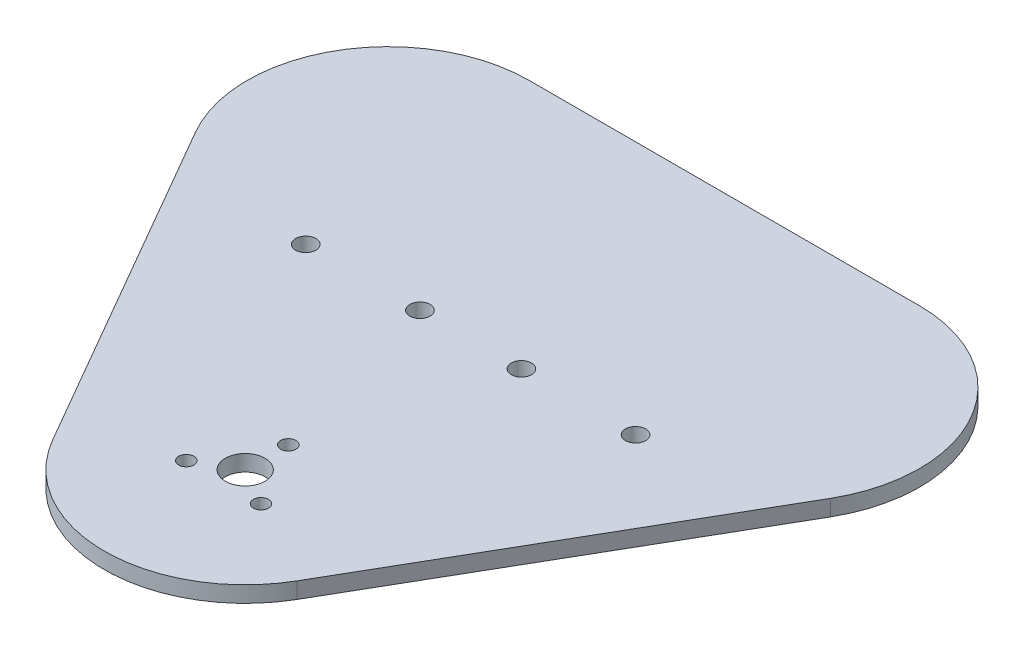
ISO-10303-21;
HEADER;
FILE_DESCRIPTION(('STEP AP214'),'2;1');
FILE_NAME('part.step','',(''),(''),'','','');
FILE_SCHEMA(('AUTOMOTIVE_DESIGN { 1 0 10303 214 1 1 1 1 }'));
ENDSEC;
DATA;
#1=APPLICATION_CONTEXT('core data for automotive mechanical design processes');
#2=APPLICATION_PROTOCOL_DEFINITION('international standard','automotive_design',2000,#1);
#3=PRODUCT_CONTEXT('',#1,'mechanical');
#4=PRODUCT('Part','Part','',(#3));
#5=PRODUCT_RELATED_PRODUCT_CATEGORY('part','',(#4));
#6=PRODUCT_DEFINITION_FORMATION('','',#4);
#7=PRODUCT_DEFINITION_CONTEXT('part definition',#1,'design');
#8=PRODUCT_DEFINITION('design','',#6,#7);
#9=PRODUCT_DEFINITION_SHAPE('','',#8);
#10=(LENGTH_UNIT() NAMED_UNIT(*) SI_UNIT(.MILLI.,.METRE.));
#11=(NAMED_UNIT(*) PLANE_ANGLE_UNIT() SI_UNIT($,.RADIAN.));
#12=(NAMED_UNIT(*) SI_UNIT($,.STERADIAN.) SOLID_ANGLE_UNIT());
#13=UNCERTAINTY_MEASURE_WITH_UNIT(LENGTH_MEASURE(1.E-05),#10,'distance_accuracy_value','');
#14=(GEOMETRIC_REPRESENTATION_CONTEXT(3) GLOBAL_UNCERTAINTY_ASSIGNED_CONTEXT((#13)) GLOBAL_UNIT_ASSIGNED_CONTEXT((#10,
#11,#12)) REPRESENTATION_CONTEXT('',''));
#15=CARTESIAN_POINT('',(0.,0.,0.));
#16=DIRECTION('',(0.,0.,1.));
#17=DIRECTION('',(1.,0.,0.));
#18=AXIS2_PLACEMENT_3D('',#15,#16,#17);
#19=CARTESIAN_POINT('',(86.6025403784437,3.175,-55.0549417933341));
#20=DIRECTION('',(-0.866025403784439,0.,-0.499999999999999));
#21=DIRECTION('',(-0.499999999999999,0.,0.866025403784439));
#22=AXIS2_PLACEMENT_3D('',#19,#20,#21);
#23=PLANE('',#22);
#24=DIRECTION('',(0.499999999999999,0.,-0.866025403784439));
#25=VECTOR('',#24,1.);
#26=CARTESIAN_POINT('',(86.6025403784437,0.,-55.0549417933341));
#27=LINE('',#26,#25);
#28=CARTESIAN_POINT('',(24.0581857171318,0.,53.2750582066658));
#29=VERTEX_POINT('',#28);
#30=CARTESIAN_POINT('',(62.5443546613121,0.,-13.3849417933341));
#31=VERTEX_POINT('',#30);
#32=EDGE_CURVE('E125',#29,#31,#27,.T.);
#33=ORIENTED_EDGE('',*,*,#32,.T.);
#34=DIRECTION('',(0.,-1.,0.));
#35=VECTOR('',#34,1.);
#36=CARTESIAN_POINT('',(62.5443546613121,3.175,-13.3849417933341));
#37=LINE('',#36,#35);
#38=CARTESIAN_POINT('',(62.5443546613121,3.175,-13.3849417933341));
#39=VERTEX_POINT('',#38);
#40=EDGE_CURVE('E101',#31,#39,#37,.F.);
#41=ORIENTED_EDGE('',*,*,#40,.T.);
#42=DIRECTION('',(0.499999999999999,0.,-0.866025403784439));
#43=VECTOR('',#42,1.);
#44=CARTESIAN_POINT('',(86.6025403784437,3.175,-55.0549417933341));
#45=LINE('',#44,#43);
#46=CARTESIAN_POINT('',(24.0581857171318,3.175,53.2750582066658));
#47=VERTEX_POINT('',#46);
#48=EDGE_CURVE('E129',#47,#39,#45,.T.);
#49=ORIENTED_EDGE('',*,*,#48,.F.);
#50=DIRECTION('',(0.,-1.,0.));
#51=VECTOR('',#50,1.);
#52=CARTESIAN_POINT('',(24.0581857171318,3.175,53.2750582066658));
#53=LINE('',#52,#51);
#54=EDGE_CURVE('E107',#47,#29,#53,.T.);
#55=ORIENTED_EDGE('',*,*,#54,.T.);
#56=EDGE_LOOP('',(#33,#41,#49,#55));
#57=FACE_BOUND('',#56,.T.);
#58=ADVANCED_FACE('F39',(#57),#23,.F.);
#59=CARTESIAN_POINT('',(-86.6025403784438,3.175,-55.0549417933341));
#60=DIRECTION('',(0.,0.,1.));
#61=DIRECTION('',(1.,0.,0.));
#62=AXIS2_PLACEMENT_3D('',#59,#60,#61);
#63=PLANE('',#62);
#64=DIRECTION('',(-1.,0.,0.));
#65=VECTOR('',#64,1.);
#66=CARTESIAN_POINT('',(-86.6025403784438,3.175,-55.0549417933341));
#67=LINE('',#66,#65);
#68=CARTESIAN_POINT('',(38.4861689441804,3.175,-55.0549417933341));
#69=VERTEX_POINT('',#68);
#70=CARTESIAN_POINT('',(-38.4861689441804,3.175,-55.0549417933341));
#71=VERTEX_POINT('',#70);
#72=EDGE_CURVE('E116',#69,#71,#67,.T.);
#73=ORIENTED_EDGE('',*,*,#72,.F.);
#74=DIRECTION('',(0.,-1.,0.));
#75=VECTOR('',#74,1.);
#76=CARTESIAN_POINT('',(38.4861689441804,3.175,-55.0549417933341));
#77=LINE('',#76,#75);
#78=CARTESIAN_POINT('',(38.4861689441804,0.,-55.0549417933341));
#79=VERTEX_POINT('',#78);
#80=EDGE_CURVE('E100',#69,#79,#77,.T.);
#81=ORIENTED_EDGE('',*,*,#80,.T.);
#82=DIRECTION('',(-1.,0.,0.));
#83=VECTOR('',#82,1.);
#84=CARTESIAN_POINT('',(-86.6025403784438,0.,-55.0549417933341));
#85=LINE('',#84,#83);
#86=CARTESIAN_POINT('',(-38.4861689441804,0.,-55.0549417933341));
#87=VERTEX_POINT('',#86);
#88=EDGE_CURVE('E114',#79,#87,#85,.T.);
#89=ORIENTED_EDGE('',*,*,#88,.T.);
#90=DIRECTION('',(0.,-1.,0.));
#91=VECTOR('',#90,1.);
#92=CARTESIAN_POINT('',(-38.4861689441804,3.175,-55.0549417933341));
#93=LINE('',#92,#91);
#94=EDGE_CURVE('E119',#87,#71,#93,.F.);
#95=ORIENTED_EDGE('',*,*,#94,.T.);
#96=EDGE_LOOP('',(#73,#81,#89,#95));
#97=FACE_BOUND('',#96,.T.);
#98=ADVANCED_FACE('F113',(#97),#63,.F.);
#99=CARTESIAN_POINT('',(0.,3.175,94.9450582066659));
#100=DIRECTION('',(0.866025403784439,0.,-0.5));
#101=DIRECTION('',(-0.5,0.,-0.866025403784439));
#102=AXIS2_PLACEMENT_3D('',#99,#100,#101);
#103=PLANE('',#102);
#104=DIRECTION('',(0.5,0.,0.866025403784439));
#105=VECTOR('',#104,1.);
#106=CARTESIAN_POINT('',(0.,3.175,94.9450582066659));
#107=LINE('',#106,#105);
#108=CARTESIAN_POINT('',(-62.5443546613121,3.175,-13.3849417933341));
#109=VERTEX_POINT('',#108);
#110=CARTESIAN_POINT('',(-24.0581857171317,3.175,53.2750582066658));
#111=VERTEX_POINT('',#110);
#112=EDGE_CURVE('E136',#109,#111,#107,.T.);
#113=ORIENTED_EDGE('',*,*,#112,.F.);
#114=DIRECTION('',(0.,-1.,0.));
#115=VECTOR('',#114,1.);
#116=CARTESIAN_POINT('',(-62.5443546613121,3.175,-13.3849417933341));
#117=LINE('',#116,#115);
#118=CARTESIAN_POINT('',(-62.5443546613121,0.,-13.3849417933341));
#119=VERTEX_POINT('',#118);
#120=EDGE_CURVE('E11',#109,#119,#117,.T.);
#121=ORIENTED_EDGE('',*,*,#120,.T.);
#122=DIRECTION('',(0.5,0.,0.866025403784439));
#123=VECTOR('',#122,1.);
#124=CARTESIAN_POINT('',(0.,0.,94.9450582066659));
#125=LINE('',#124,#123);
#126=CARTESIAN_POINT('',(-24.0581857171317,0.,53.2750582066658));
#127=VERTEX_POINT('',#126);
#128=EDGE_CURVE('E124',#119,#127,#125,.T.);
#129=ORIENTED_EDGE('',*,*,#128,.T.);
#130=DIRECTION('',(0.,-1.,0.));
#131=VECTOR('',#130,1.);
#132=CARTESIAN_POINT('',(-24.0581857171317,3.175,53.2750582066658));
#133=LINE('',#132,#131);
#134=EDGE_CURVE('E49',#127,#111,#133,.F.);
#135=ORIENTED_EDGE('',*,*,#134,.T.);
#136=EDGE_LOOP('',(#113,#121,#129,#135));
#137=FACE_BOUND('',#136,.T.);
#138=ADVANCED_FACE('F199',(#137),#103,.F.);
#139=CARTESIAN_POINT('',(0.,3.175,0.));
#140=DIRECTION('',(0.,-1.,0.));
#141=DIRECTION('',(0.,0.,-1.));
#142=AXIS2_PLACEMENT_3D('',#139,#140,#141);
#143=PLANE('',#142);
#144=CARTESIAN_POINT('',(0.,3.175,30.8850582066658));
#145=DIRECTION('',(0.,1.,0.));
#146=DIRECTION('',(0.,0.,1.));
#147=AXIS2_PLACEMENT_3D('',#144,#145,#146);
#148=CIRCLE('',#147,1.5);
#149=CARTESIAN_POINT('',(0.,3.175,32.3850582066658));
#150=VERTEX_POINT('',#149);
#151=EDGE_CURVE('E162',#150,#150,#148,.T.);
#152=ORIENTED_EDGE('',*,*,#151,.F.);
#153=EDGE_LOOP('',(#152));
#154=FACE_BOUND('',#153,.T.);
#155=CARTESIAN_POINT('',(-7.36121593216768,3.175,43.6350582066658));
#156=DIRECTION('',(0.,1.,0.));
#157=DIRECTION('',(0.,0.,1.));
#158=AXIS2_PLACEMENT_3D('',#155,#156,#157);
#159=CIRCLE('',#158,1.5);
#160=CARTESIAN_POINT('',(-7.36121593216768,3.175,45.1350582066658));
#161=VERTEX_POINT('',#160);
#162=EDGE_CURVE('E258',#161,#161,#159,.T.);
#163=ORIENTED_EDGE('',*,*,#162,.F.);
#164=EDGE_LOOP('',(#163));
#165=FACE_BOUND('',#164,.T.);
#166=CARTESIAN_POINT('',(0.,3.175,39.3850582066658));
#167=DIRECTION('',(0.,1.,0.));
#168=DIRECTION('',(0.,0.,1.));
#169=AXIS2_PLACEMENT_3D('',#166,#167,#168);
#170=CIRCLE('',#169,3.925);
#171=CARTESIAN_POINT('',(0.,3.175,43.3100582066658));
#172=VERTEX_POINT('',#171);
#173=EDGE_CURVE('E262',#172,#172,#170,.T.);
#174=ORIENTED_EDGE('',*,*,#173,.F.);
#175=EDGE_LOOP('',(#174));
#176=FACE_BOUND('',#175,.T.);
#177=CARTESIAN_POINT('',(7.36121593216777,3.175,43.6350582066658));
#178=DIRECTION('',(0.,1.,0.));
#179=DIRECTION('',(0.,0.,1.));
#180=AXIS2_PLACEMENT_3D('',#177,#178,#179);
#181=CIRCLE('',#180,1.5);
#182=CARTESIAN_POINT('',(7.36121593216777,3.175,45.1350582066658));
#183=VERTEX_POINT('',#182);
#184=EDGE_CURVE('E268',#183,#183,#181,.T.);
#185=ORIENTED_EDGE('',*,*,#184,.F.);
#186=EDGE_LOOP('',(#185));
#187=FACE_BOUND('',#186,.T.);
#188=CARTESIAN_POINT('',(32.5,3.175,-5.0549417933341));
#189=DIRECTION('',(0.,1.,0.));
#190=DIRECTION('',(0.,0.,1.));
#191=AXIS2_PLACEMENT_3D('',#188,#189,#190);
#192=CIRCLE('',#191,2.);
#193=CARTESIAN_POINT('',(32.5,3.175,-3.0549417933341));
#194=VERTEX_POINT('',#193);
#195=EDGE_CURVE('E275',#194,#194,#192,.T.);
#196=ORIENTED_EDGE('',*,*,#195,.F.);
#197=EDGE_LOOP('',(#196));
#198=FACE_BOUND('',#197,.T.);
#199=CARTESIAN_POINT('',(-32.5,3.175,-5.0549417933341));
#200=DIRECTION('',(0.,1.,0.));
#201=DIRECTION('',(0.,0.,1.));
#202=AXIS2_PLACEMENT_3D('',#199,#200,#201);
#203=CIRCLE('',#202,2.);
#204=CARTESIAN_POINT('',(-32.5,3.175,-3.0549417933341));
#205=VERTEX_POINT('',#204);
#206=EDGE_CURVE('E283',#205,#205,#203,.T.);
#207=ORIENTED_EDGE('',*,*,#206,.F.);
#208=EDGE_LOOP('',(#207));
#209=FACE_BOUND('',#208,.T.);
#210=CARTESIAN_POINT('',(-10.,3.175,-5.0549417933341));
#211=DIRECTION('',(0.,1.,0.));
#212=DIRECTION('',(0.,0.,1.));
#213=AXIS2_PLACEMENT_3D('',#210,#211,#212);
#214=CIRCLE('',#213,2.);
#215=CARTESIAN_POINT('',(-10.,3.175,-3.0549417933341));
#216=VERTEX_POINT('',#215);
#217=EDGE_CURVE('E183',#216,#216,#214,.T.);
#218=ORIENTED_EDGE('',*,*,#217,.F.);
#219=EDGE_LOOP('',(#218));
#220=FACE_BOUND('',#219,.T.);
#221=CARTESIAN_POINT('',(10.,3.175,-5.0549417933341));
#222=DIRECTION('',(0.,1.,0.));
#223=DIRECTION('',(0.,0.,1.));
#224=AXIS2_PLACEMENT_3D('',#221,#222,#223);
#225=CIRCLE('',#224,2.);
#226=CARTESIAN_POINT('',(10.,3.175,-3.0549417933341));
#227=VERTEX_POINT('',#226);
#228=EDGE_CURVE('E172',#227,#227,#225,.T.);
#229=ORIENTED_EDGE('',*,*,#228,.F.);
#230=EDGE_LOOP('',(#229));
#231=FACE_BOUND('',#230,.T.);
#232=ORIENTED_EDGE('',*,*,#48,.T.);
#233=CARTESIAN_POINT('',(38.4861689441804,3.175,-27.2749417933341));
#234=DIRECTION('',(0.,-1.,0.));
#235=DIRECTION('',(0.,0.,-1.));
#236=AXIS2_PLACEMENT_3D('',#233,#234,#235);
#237=CIRCLE('',#236,27.78);
#238=EDGE_CURVE('E152',#39,#69,#237,.F.);
#239=ORIENTED_EDGE('',*,*,#238,.T.);
#240=ORIENTED_EDGE('',*,*,#72,.T.);
#241=CARTESIAN_POINT('',(-38.4861689441804,3.175,-27.2749417933341));
#242=DIRECTION('',(0.,-1.,0.));
#243=DIRECTION('',(0.,0.,-1.));
#244=AXIS2_PLACEMENT_3D('',#241,#242,#243);
#245=CIRCLE('',#244,27.78);
#246=EDGE_CURVE('E63',#71,#109,#245,.F.);
#247=ORIENTED_EDGE('',*,*,#246,.T.);
#248=ORIENTED_EDGE('',*,*,#112,.T.);
#249=CARTESIAN_POINT('',(0.,3.175,39.3850582066658));
#250=DIRECTION('',(0.,-1.,0.));
#251=DIRECTION('',(0.,0.,-1.));
#252=AXIS2_PLACEMENT_3D('',#249,#250,#251);
#253=CIRCLE('',#252,27.78);
#254=EDGE_CURVE('E147',#111,#47,#253,.F.);
#255=ORIENTED_EDGE('',*,*,#254,.T.);
#256=EDGE_LOOP('',(#232,#239,#240,#247,#248,#255));
#257=FACE_BOUND('',#256,.T.);
#258=ADVANCED_FACE('F193',(#154,#165,#176,#187,#198,#209,#220,#231,#257),#143,.F.);
#259=CARTESIAN_POINT('',(0.,0.,0.));
#260=DIRECTION('',(0.,-1.,0.));
#261=DIRECTION('',(0.,0.,-1.));
#262=AXIS2_PLACEMENT_3D('',#259,#260,#261);
#263=PLANE('',#262);
#264=CARTESIAN_POINT('',(0.,0.,30.8850582066658));
#265=DIRECTION('',(0.,-1.,0.));
#266=DIRECTION('',(0.,0.,-1.));
#267=AXIS2_PLACEMENT_3D('',#264,#265,#266);
#268=CIRCLE('',#267,1.5);
#269=CARTESIAN_POINT('',(0.,0.,29.3850582066658));
#270=VERTEX_POINT('',#269);
#271=EDGE_CURVE('E43',#270,#270,#268,.T.);
#272=ORIENTED_EDGE('',*,*,#271,.F.);
#273=EDGE_LOOP('',(#272));
#274=FACE_BOUND('',#273,.T.);
#275=CARTESIAN_POINT('',(-7.36121593216768,0.,43.6350582066658));
#276=DIRECTION('',(0.,-1.,0.));
#277=DIRECTION('',(0.,0.,-1.));
#278=AXIS2_PLACEMENT_3D('',#275,#276,#277);
#279=CIRCLE('',#278,1.5);
#280=CARTESIAN_POINT('',(-7.36121593216768,0.,42.1350582066658));
#281=VERTEX_POINT('',#280);
#282=EDGE_CURVE('E165',#281,#281,#279,.T.);
#283=ORIENTED_EDGE('',*,*,#282,.F.);
#284=EDGE_LOOP('',(#283));
#285=FACE_BOUND('',#284,.T.);
#286=CARTESIAN_POINT('',(0.,0.,39.3850582066658));
#287=DIRECTION('',(0.,-1.,0.));
#288=DIRECTION('',(0.,0.,-1.));
#289=AXIS2_PLACEMENT_3D('',#286,#287,#288);
#290=CIRCLE('',#289,3.925);
#291=CARTESIAN_POINT('',(0.,0.,35.4600582066658));
#292=VERTEX_POINT('',#291);
#293=EDGE_CURVE('E161',#292,#292,#290,.T.);
#294=ORIENTED_EDGE('',*,*,#293,.F.);
#295=EDGE_LOOP('',(#294));
#296=FACE_BOUND('',#295,.T.);
#297=CARTESIAN_POINT('',(7.36121593216777,0.,43.6350582066658));
#298=DIRECTION('',(0.,-1.,0.));
#299=DIRECTION('',(0.,0.,-1.));
#300=AXIS2_PLACEMENT_3D('',#297,#298,#299);
#301=CIRCLE('',#300,1.5);
#302=CARTESIAN_POINT('',(7.36121593216777,0.,42.1350582066658));
#303=VERTEX_POINT('',#302);
#304=EDGE_CURVE('E157',#303,#303,#301,.T.);
#305=ORIENTED_EDGE('',*,*,#304,.F.);
#306=EDGE_LOOP('',(#305));
#307=FACE_BOUND('',#306,.T.);
#308=CARTESIAN_POINT('',(32.5,0.,-5.0549417933341));
#309=DIRECTION('',(0.,1.,0.));
#310=DIRECTION('',(0.,0.,1.));
#311=AXIS2_PLACEMENT_3D('',#308,#309,#310);
#312=CIRCLE('',#311,2.);
#313=CARTESIAN_POINT('',(32.5,0.,-3.0549417933341));
#314=VERTEX_POINT('',#313);
#315=EDGE_CURVE('E131',#314,#314,#312,.T.);
#316=ORIENTED_EDGE('',*,*,#315,.T.);
#317=EDGE_LOOP('',(#316));
#318=FACE_BOUND('',#317,.T.);
#319=CARTESIAN_POINT('',(-32.5,0.,-5.0549417933341));
#320=DIRECTION('',(0.,1.,0.));
#321=DIRECTION('',(0.,0.,1.));
#322=AXIS2_PLACEMENT_3D('',#319,#320,#321);
#323=CIRCLE('',#322,2.);
#324=CARTESIAN_POINT('',(-32.5,0.,-3.0549417933341));
#325=VERTEX_POINT('',#324);
#326=EDGE_CURVE('E279',#325,#325,#323,.T.);
#327=ORIENTED_EDGE('',*,*,#326,.T.);
#328=EDGE_LOOP('',(#327));
#329=FACE_BOUND('',#328,.T.);
#330=CARTESIAN_POINT('',(-10.,0.,-5.0549417933341));
#331=DIRECTION('',(0.,1.,0.));
#332=DIRECTION('',(0.,0.,1.));
#333=AXIS2_PLACEMENT_3D('',#330,#331,#332);
#334=CIRCLE('',#333,2.);
#335=CARTESIAN_POINT('',(-10.,0.,-3.0549417933341));
#336=VERTEX_POINT('',#335);
#337=EDGE_CURVE('E287',#336,#336,#334,.T.);
#338=ORIENTED_EDGE('',*,*,#337,.T.);
#339=EDGE_LOOP('',(#338));
#340=FACE_BOUND('',#339,.T.);
#341=CARTESIAN_POINT('',(10.,0.,-5.0549417933341));
#342=DIRECTION('',(0.,1.,0.));
#343=DIRECTION('',(0.,0.,1.));
#344=AXIS2_PLACEMENT_3D('',#341,#342,#343);
#345=CIRCLE('',#344,2.);
#346=CARTESIAN_POINT('',(10.,0.,-3.0549417933341));
#347=VERTEX_POINT('',#346);
#348=EDGE_CURVE('E177',#347,#347,#345,.T.);
#349=ORIENTED_EDGE('',*,*,#348,.T.);
#350=EDGE_LOOP('',(#349));
#351=FACE_BOUND('',#350,.T.);
#352=ORIENTED_EDGE('',*,*,#88,.F.);
#353=CARTESIAN_POINT('',(38.4861689441804,0.,-27.2749417933341));
#354=DIRECTION('',(0.,-1.,0.));
#355=DIRECTION('',(0.,0.,-1.));
#356=AXIS2_PLACEMENT_3D('',#353,#354,#355);
#357=CIRCLE('',#356,27.78);
#358=EDGE_CURVE('E96',#79,#31,#357,.T.);
#359=ORIENTED_EDGE('',*,*,#358,.T.);
#360=ORIENTED_EDGE('',*,*,#32,.F.);
#361=CARTESIAN_POINT('',(0.,0.,39.3850582066658));
#362=DIRECTION('',(0.,-1.,0.));
#363=DIRECTION('',(0.,0.,-1.));
#364=AXIS2_PLACEMENT_3D('',#361,#362,#363);
#365=CIRCLE('',#364,27.78);
#366=EDGE_CURVE('E118',#29,#127,#365,.T.);
#367=ORIENTED_EDGE('',*,*,#366,.T.);
#368=ORIENTED_EDGE('',*,*,#128,.F.);
#369=CARTESIAN_POINT('',(-38.4861689441804,0.,-27.2749417933341));
#370=DIRECTION('',(0.,-1.,0.));
#371=DIRECTION('',(0.,0.,-1.));
#372=AXIS2_PLACEMENT_3D('',#369,#370,#371);
#373=CIRCLE('',#372,27.78);
#374=EDGE_CURVE('E108',#119,#87,#373,.T.);
#375=ORIENTED_EDGE('',*,*,#374,.T.);
#376=EDGE_LOOP('',(#352,#359,#360,#367,#368,#375));
#377=FACE_BOUND('',#376,.T.);
#378=ADVANCED_FACE('F121',(#274,#285,#296,#307,#318,#329,#340,#351,#377),#263,.T.);
#379=CARTESIAN_POINT('',(38.4861689441804,3.175,-27.2749417933341));
#380=DIRECTION('',(0.,-1.,0.));
#381=DIRECTION('',(0.,0.,-1.));
#382=AXIS2_PLACEMENT_3D('',#379,#380,#381);
#383=CYLINDRICAL_SURFACE('',#382,27.78);
#384=ORIENTED_EDGE('',*,*,#238,.F.);
#385=ORIENTED_EDGE('',*,*,#40,.F.);
#386=ORIENTED_EDGE('',*,*,#358,.F.);
#387=ORIENTED_EDGE('',*,*,#80,.F.);
#388=EDGE_LOOP('',(#384,#385,#386,#387));
#389=FACE_BOUND('',#388,.T.);
#390=ADVANCED_FACE('F99',(#389),#383,.T.);
#391=CARTESIAN_POINT('',(-38.4861689441804,3.175,-27.2749417933341));
#392=DIRECTION('',(0.,-1.,0.));
#393=DIRECTION('',(0.,0.,-1.));
#394=AXIS2_PLACEMENT_3D('',#391,#392,#393);
#395=CYLINDRICAL_SURFACE('',#394,27.78);
#396=ORIENTED_EDGE('',*,*,#246,.F.);
#397=ORIENTED_EDGE('',*,*,#94,.F.);
#398=ORIENTED_EDGE('',*,*,#374,.F.);
#399=ORIENTED_EDGE('',*,*,#120,.F.);
#400=EDGE_LOOP('',(#396,#397,#398,#399));
#401=FACE_BOUND('',#400,.T.);
#402=ADVANCED_FACE('F201',(#401),#395,.T.);
#403=CARTESIAN_POINT('',(0.,3.175,39.3850582066658));
#404=DIRECTION('',(0.,-1.,0.));
#405=DIRECTION('',(0.,0.,-1.));
#406=AXIS2_PLACEMENT_3D('',#403,#404,#405);
#407=CYLINDRICAL_SURFACE('',#406,27.78);
#408=ORIENTED_EDGE('',*,*,#254,.F.);
#409=ORIENTED_EDGE('',*,*,#134,.F.);
#410=ORIENTED_EDGE('',*,*,#366,.F.);
#411=ORIENTED_EDGE('',*,*,#54,.F.);
#412=EDGE_LOOP('',(#408,#409,#410,#411));
#413=FACE_BOUND('',#412,.T.);
#414=ADVANCED_FACE('F41',(#413),#407,.T.);
#415=CARTESIAN_POINT('',(10.,0.,-5.0549417933341));
#416=DIRECTION('',(0.,1.,0.));
#417=DIRECTION('',(0.,0.,1.));
#418=AXIS2_PLACEMENT_3D('',#415,#416,#417);
#419=CYLINDRICAL_SURFACE('',#418,2.);
#420=ORIENTED_EDGE('',*,*,#348,.F.);
#421=EDGE_LOOP('',(#420));
#422=FACE_BOUND('',#421,.T.);
#423=ORIENTED_EDGE('',*,*,#228,.T.);
#424=EDGE_LOOP('',(#423));
#425=FACE_BOUND('',#424,.T.);
#426=ADVANCED_FACE('F207',(#422,#425),#419,.F.);
#427=CARTESIAN_POINT('',(-10.,0.,-5.0549417933341));
#428=DIRECTION('',(0.,1.,0.));
#429=DIRECTION('',(0.,0.,1.));
#430=AXIS2_PLACEMENT_3D('',#427,#428,#429);
#431=CYLINDRICAL_SURFACE('',#430,2.);
#432=ORIENTED_EDGE('',*,*,#337,.F.);
#433=EDGE_LOOP('',(#432));
#434=FACE_BOUND('',#433,.T.);
#435=ORIENTED_EDGE('',*,*,#217,.T.);
#436=EDGE_LOOP('',(#435));
#437=FACE_BOUND('',#436,.T.);
#438=ADVANCED_FACE('F226',(#434,#437),#431,.F.);
#439=CARTESIAN_POINT('',(-32.5,0.,-5.0549417933341));
#440=DIRECTION('',(0.,1.,0.));
#441=DIRECTION('',(0.,0.,1.));
#442=AXIS2_PLACEMENT_3D('',#439,#440,#441);
#443=CYLINDRICAL_SURFACE('',#442,2.);
#444=ORIENTED_EDGE('',*,*,#326,.F.);
#445=EDGE_LOOP('',(#444));
#446=FACE_BOUND('',#445,.T.);
#447=ORIENTED_EDGE('',*,*,#206,.T.);
#448=EDGE_LOOP('',(#447));
#449=FACE_BOUND('',#448,.T.);
#450=ADVANCED_FACE('F230',(#446,#449),#443,.F.);
#451=CARTESIAN_POINT('',(32.5,0.,-5.0549417933341));
#452=DIRECTION('',(0.,1.,0.));
#453=DIRECTION('',(0.,0.,1.));
#454=AXIS2_PLACEMENT_3D('',#451,#452,#453);
#455=CYLINDRICAL_SURFACE('',#454,2.);
#456=ORIENTED_EDGE('',*,*,#315,.F.);
#457=EDGE_LOOP('',(#456));
#458=FACE_BOUND('',#457,.T.);
#459=ORIENTED_EDGE('',*,*,#195,.T.);
#460=EDGE_LOOP('',(#459));
#461=FACE_BOUND('',#460,.T.);
#462=ADVANCED_FACE('F234',(#458,#461),#455,.F.);
#463=CARTESIAN_POINT('',(7.36121593216777,-6.825,43.6350582066658));
#464=DIRECTION('',(0.,1.,0.));
#465=DIRECTION('',(0.,0.,1.));
#466=AXIS2_PLACEMENT_3D('',#463,#464,#465);
#467=CYLINDRICAL_SURFACE('',#466,1.5);
#468=ORIENTED_EDGE('',*,*,#304,.T.);
#469=EDGE_LOOP('',(#468));
#470=FACE_BOUND('',#469,.T.);
#471=ORIENTED_EDGE('',*,*,#184,.T.);
#472=EDGE_LOOP('',(#471));
#473=FACE_BOUND('',#472,.T.);
#474=ADVANCED_FACE('F238',(#470,#473),#467,.F.);
#475=CARTESIAN_POINT('',(0.,-6.825,39.3850582066658));
#476=DIRECTION('',(0.,1.,0.));
#477=DIRECTION('',(0.,0.,1.));
#478=AXIS2_PLACEMENT_3D('',#475,#476,#477);
#479=CYLINDRICAL_SURFACE('',#478,3.925);
#480=ORIENTED_EDGE('',*,*,#293,.T.);
#481=EDGE_LOOP('',(#480));
#482=FACE_BOUND('',#481,.T.);
#483=ORIENTED_EDGE('',*,*,#173,.T.);
#484=EDGE_LOOP('',(#483));
#485=FACE_BOUND('',#484,.T.);
#486=ADVANCED_FACE('F242',(#482,#485),#479,.F.);
#487=CARTESIAN_POINT('',(-7.36121593216768,-6.825,43.6350582066658));
#488=DIRECTION('',(0.,1.,0.));
#489=DIRECTION('',(0.,0.,1.));
#490=AXIS2_PLACEMENT_3D('',#487,#488,#489);
#491=CYLINDRICAL_SURFACE('',#490,1.5);
#492=ORIENTED_EDGE('',*,*,#282,.T.);
#493=EDGE_LOOP('',(#492));
#494=FACE_BOUND('',#493,.T.);
#495=ORIENTED_EDGE('',*,*,#162,.T.);
#496=EDGE_LOOP('',(#495));
#497=FACE_BOUND('',#496,.T.);
#498=ADVANCED_FACE('F246',(#494,#497),#491,.F.);
#499=CARTESIAN_POINT('',(0.,-6.825,30.8850582066658));
#500=DIRECTION('',(0.,1.,0.));
#501=DIRECTION('',(0.,0.,1.));
#502=AXIS2_PLACEMENT_3D('',#499,#500,#501);
#503=CYLINDRICAL_SURFACE('',#502,1.5);
#504=ORIENTED_EDGE('',*,*,#271,.T.);
#505=EDGE_LOOP('',(#504));
#506=FACE_BOUND('',#505,.T.);
#507=ORIENTED_EDGE('',*,*,#151,.T.);
#508=EDGE_LOOP('',(#507));
#509=FACE_BOUND('',#508,.T.);
#510=ADVANCED_FACE('F250',(#506,#509),#503,.F.);
#511=CLOSED_SHELL('',(#58,#98,#138,#258,#378,#390,#402,#414,#426,#438,#450,#462,#474,#486,#498,#510));
#512=MANIFOLD_SOLID_BREP('B2',#511);
#513=ADVANCED_BREP_SHAPE_REPRESENTATION('',(#18,#512),#14);
#514=SHAPE_DEFINITION_REPRESENTATION(#9,#513);
ENDSEC;
END-ISO-10303-21;
